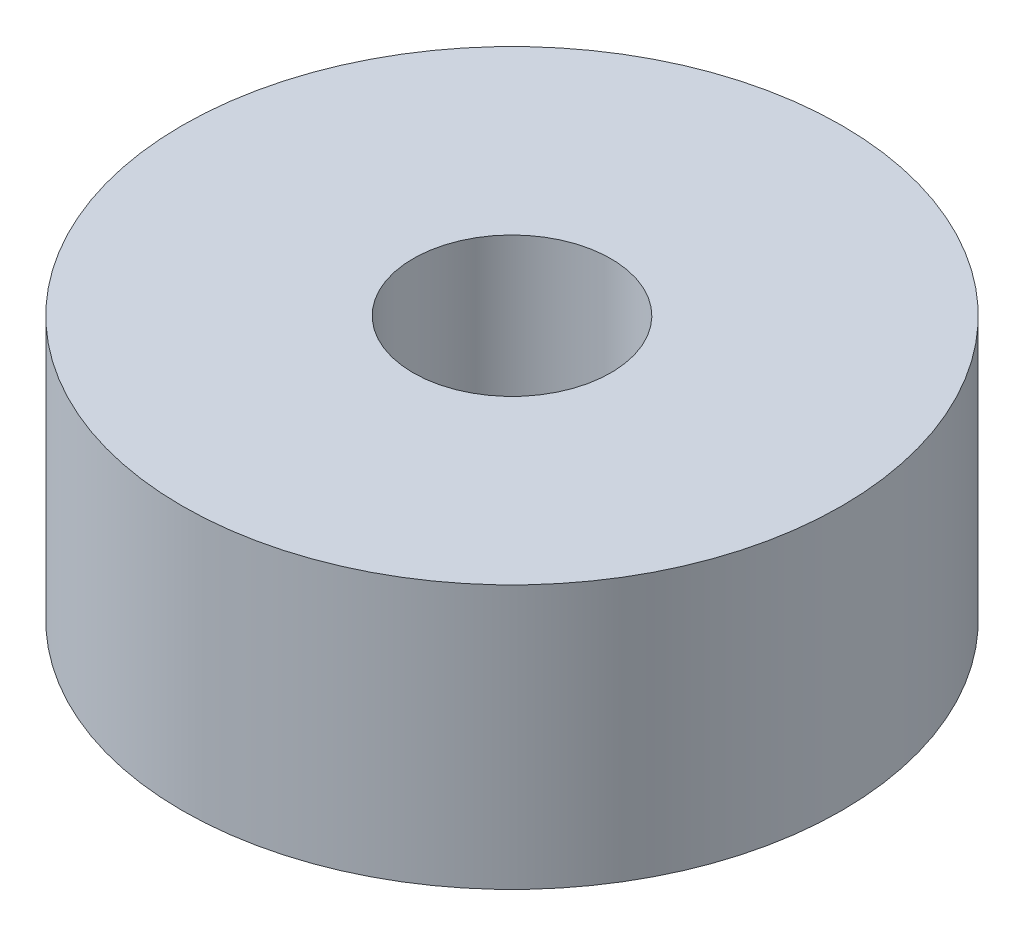
ISO-10303-21;
HEADER;
FILE_DESCRIPTION(('STEP AP214'),'2;1');
FILE_NAME('part.step','',(''),(''),'','','');
FILE_SCHEMA(('AUTOMOTIVE_DESIGN { 1 0 10303 214 1 1 1 1 }'));
ENDSEC;
DATA;
#1=APPLICATION_CONTEXT('core data for automotive mechanical design processes');
#2=APPLICATION_PROTOCOL_DEFINITION('international standard','automotive_design',2000,#1);
#3=PRODUCT_CONTEXT('',#1,'mechanical');
#4=PRODUCT('Part','Part','',(#3));
#5=PRODUCT_RELATED_PRODUCT_CATEGORY('part','',(#4));
#6=PRODUCT_DEFINITION_FORMATION('','',#4);
#7=PRODUCT_DEFINITION_CONTEXT('part definition',#1,'design');
#8=PRODUCT_DEFINITION('design','',#6,#7);
#9=PRODUCT_DEFINITION_SHAPE('','',#8);
#10=(LENGTH_UNIT() NAMED_UNIT(*) SI_UNIT(.MILLI.,.METRE.));
#11=(NAMED_UNIT(*) PLANE_ANGLE_UNIT() SI_UNIT($,.RADIAN.));
#12=(NAMED_UNIT(*) SI_UNIT($,.STERADIAN.) SOLID_ANGLE_UNIT());
#13=UNCERTAINTY_MEASURE_WITH_UNIT(LENGTH_MEASURE(1.E-05),#10,'distance_accuracy_value','');
#14=(GEOMETRIC_REPRESENTATION_CONTEXT(3) GLOBAL_UNCERTAINTY_ASSIGNED_CONTEXT((#13)) GLOBAL_UNIT_ASSIGNED_CONTEXT((#10,
#11,#12)) REPRESENTATION_CONTEXT('',''));
#15=CARTESIAN_POINT('',(0.,0.,0.));
#16=DIRECTION('',(0.,0.,1.));
#17=DIRECTION('',(1.,0.,0.));
#18=AXIS2_PLACEMENT_3D('',#15,#16,#17);
#19=CARTESIAN_POINT('',(0.,25.4,0.));
#20=DIRECTION('',(0.,1.,0.));
#21=DIRECTION('',(0.,0.,1.));
#22=AXIS2_PLACEMENT_3D('',#19,#20,#21);
#23=PLANE('',#22);
#24=CARTESIAN_POINT('',(0.,25.4,0.));
#25=DIRECTION('',(0.,1.,0.));
#26=DIRECTION('',(0.,0.,1.));
#27=AXIS2_PLACEMENT_3D('',#24,#25,#26);
#28=CIRCLE('',#27,63.5);
#29=CARTESIAN_POINT('',(0.,25.4,63.5));
#30=VERTEX_POINT('',#29);
#31=EDGE_CURVE('E10',#30,#30,#28,.T.);
#32=ORIENTED_EDGE('',*,*,#31,.T.);
#33=EDGE_LOOP('',(#32));
#34=FACE_BOUND('',#33,.T.);
#35=CARTESIAN_POINT('',(0.,25.4,0.));
#36=DIRECTION('',(0.,1.,0.));
#37=DIRECTION('',(0.,0.,1.));
#38=AXIS2_PLACEMENT_3D('',#35,#36,#37);
#39=CIRCLE('',#38,19.05);
#40=CARTESIAN_POINT('',(0.,25.4,19.05));
#41=VERTEX_POINT('',#40);
#42=EDGE_CURVE('E50',#41,#41,#39,.T.);
#43=ORIENTED_EDGE('',*,*,#42,.F.);
#44=EDGE_LOOP('',(#43));
#45=FACE_BOUND('',#44,.T.);
#46=ADVANCED_FACE('F37',(#34,#45),#23,.T.);
#47=CARTESIAN_POINT('',(0.,-25.4,0.));
#48=DIRECTION('',(0.,1.,0.));
#49=DIRECTION('',(0.,0.,1.));
#50=AXIS2_PLACEMENT_3D('',#47,#48,#49);
#51=PLANE('',#50);
#52=CARTESIAN_POINT('',(0.,-25.4,0.));
#53=DIRECTION('',(0.,1.,0.));
#54=DIRECTION('',(0.,0.,1.));
#55=AXIS2_PLACEMENT_3D('',#52,#53,#54);
#56=CIRCLE('',#55,63.5);
#57=CARTESIAN_POINT('',(0.,-25.4,63.5));
#58=VERTEX_POINT('',#57);
#59=EDGE_CURVE('E41',#58,#58,#56,.T.);
#60=ORIENTED_EDGE('',*,*,#59,.F.);
#61=EDGE_LOOP('',(#60));
#62=FACE_BOUND('',#61,.T.);
#63=CARTESIAN_POINT('',(0.,-25.4,0.));
#64=DIRECTION('',(0.,1.,0.));
#65=DIRECTION('',(0.,0.,1.));
#66=AXIS2_PLACEMENT_3D('',#63,#64,#65);
#67=CIRCLE('',#66,19.05);
#68=CARTESIAN_POINT('',(0.,-25.4,19.05));
#69=VERTEX_POINT('',#68);
#70=EDGE_CURVE('E52',#69,#69,#67,.T.);
#71=ORIENTED_EDGE('',*,*,#70,.T.);
#72=EDGE_LOOP('',(#71));
#73=FACE_BOUND('',#72,.T.);
#74=ADVANCED_FACE('F64',(#62,#73),#51,.F.);
#75=CARTESIAN_POINT('',(0.,25.4,0.));
#76=DIRECTION('',(0.,-1.,0.));
#77=DIRECTION('',(0.,0.,-1.));
#78=AXIS2_PLACEMENT_3D('',#75,#76,#77);
#79=CYLINDRICAL_SURFACE('',#78,63.5);
#80=ORIENTED_EDGE('',*,*,#31,.F.);
#81=EDGE_LOOP('',(#80));
#82=FACE_BOUND('',#81,.T.);
#83=ORIENTED_EDGE('',*,*,#59,.T.);
#84=EDGE_LOOP('',(#83));
#85=FACE_BOUND('',#84,.T.);
#86=ADVANCED_FACE('F39',(#82,#85),#79,.T.);
#87=CARTESIAN_POINT('',(0.,25.4,0.));
#88=DIRECTION('',(0.,-1.,0.));
#89=DIRECTION('',(0.,0.,-1.));
#90=AXIS2_PLACEMENT_3D('',#87,#88,#89);
#91=CYLINDRICAL_SURFACE('',#90,19.05);
#92=ORIENTED_EDGE('',*,*,#42,.T.);
#93=EDGE_LOOP('',(#92));
#94=FACE_BOUND('',#93,.T.);
#95=ORIENTED_EDGE('',*,*,#70,.F.);
#96=EDGE_LOOP('',(#95));
#97=FACE_BOUND('',#96,.T.);
#98=ADVANCED_FACE('F60',(#94,#97),#91,.F.);
#99=CLOSED_SHELL('',(#46,#74,#86,#98));
#100=MANIFOLD_SOLID_BREP('B2',#99);
#101=ADVANCED_BREP_SHAPE_REPRESENTATION('',(#18,#100),#14);
#102=SHAPE_DEFINITION_REPRESENTATION(#9,#101);
ENDSEC;
END-ISO-10303-21;
